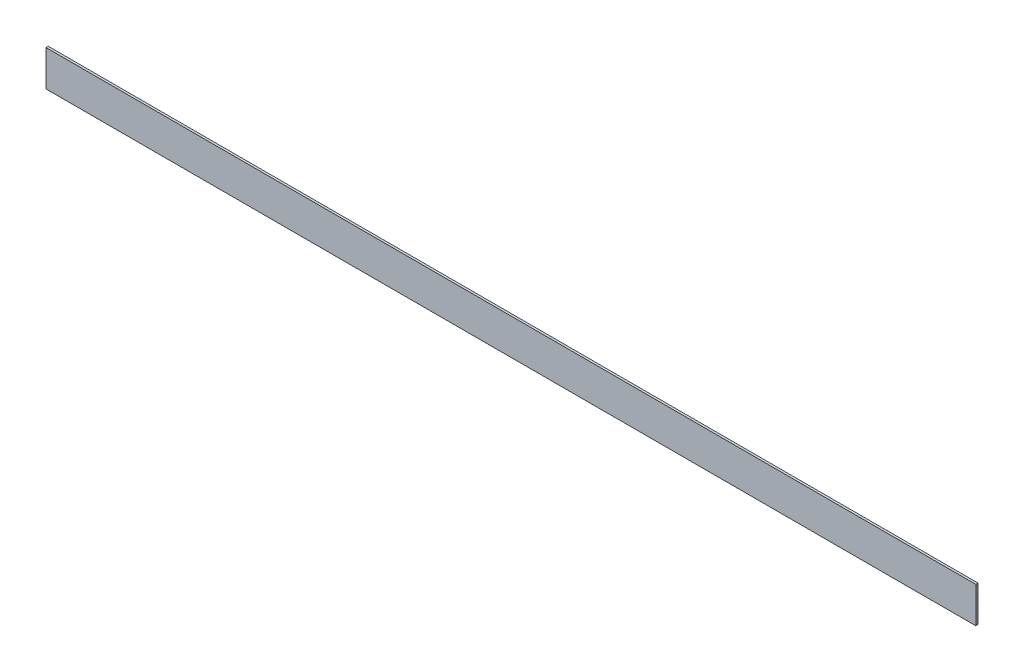
ISO-10303-21;
HEADER;
FILE_DESCRIPTION(('STEP AP214'),'2;1');
FILE_NAME('part.step','',(''),(''),'','','');
FILE_SCHEMA(('AUTOMOTIVE_DESIGN { 1 0 10303 214 1 1 1 1 }'));
ENDSEC;
DATA;
#1=APPLICATION_CONTEXT('core data for automotive mechanical design processes');
#2=APPLICATION_PROTOCOL_DEFINITION('international standard','automotive_design',2000,#1);
#3=PRODUCT_CONTEXT('',#1,'mechanical');
#4=PRODUCT('Part','Part','',(#3));
#5=PRODUCT_RELATED_PRODUCT_CATEGORY('part','',(#4));
#6=PRODUCT_DEFINITION_FORMATION('','',#4);
#7=PRODUCT_DEFINITION_CONTEXT('part definition',#1,'design');
#8=PRODUCT_DEFINITION('design','',#6,#7);
#9=PRODUCT_DEFINITION_SHAPE('','',#8);
#10=(LENGTH_UNIT() NAMED_UNIT(*) SI_UNIT(.MILLI.,.METRE.));
#11=(NAMED_UNIT(*) PLANE_ANGLE_UNIT() SI_UNIT($,.RADIAN.));
#12=(NAMED_UNIT(*) SI_UNIT($,.STERADIAN.) SOLID_ANGLE_UNIT());
#13=UNCERTAINTY_MEASURE_WITH_UNIT(LENGTH_MEASURE(1.E-05),#10,'distance_accuracy_value','');
#14=(GEOMETRIC_REPRESENTATION_CONTEXT(3) GLOBAL_UNCERTAINTY_ASSIGNED_CONTEXT((#13)) GLOBAL_UNIT_ASSIGNED_CONTEXT((#10,
#11,#12)) REPRESENTATION_CONTEXT('',''));
#15=CARTESIAN_POINT('',(0.,0.,0.));
#16=DIRECTION('',(0.,0.,1.));
#17=DIRECTION('',(1.,0.,0.));
#18=AXIS2_PLACEMENT_3D('',#15,#16,#17);
#19=CARTESIAN_POINT('',(-48.1163494307194,14.2105280702125,1.27));
#20=DIRECTION('',(1.,0.,0.));
#21=DIRECTION('',(0.,0.,-1.));
#22=AXIS2_PLACEMENT_3D('',#19,#20,#21);
#23=PLANE('',#22);
#24=DIRECTION('',(0.,-1.,0.));
#25=VECTOR('',#24,1.);
#26=CARTESIAN_POINT('',(-48.1163494307194,14.2105280702125,0.));
#27=LINE('',#26,#25);
#28=CARTESIAN_POINT('',(-48.1163494307194,14.2105280702125,0.));
#29=VERTEX_POINT('',#28);
#30=CARTESIAN_POINT('',(-48.1163494307194,-6.10947192978754,0.));
#31=VERTEX_POINT('',#30);
#32=EDGE_CURVE('E96',#29,#31,#27,.T.);
#33=ORIENTED_EDGE('',*,*,#32,.T.);
#34=DIRECTION('',(0.,0.,-1.));
#35=VECTOR('',#34,1.);
#36=CARTESIAN_POINT('',(-48.1163494307194,-6.10947192978754,1.27));
#37=LINE('',#36,#35);
#38=CARTESIAN_POINT('',(-48.1163494307194,-6.10947192978754,1.27));
#39=VERTEX_POINT('',#38);
#40=EDGE_CURVE('E11',#39,#31,#37,.T.);
#41=ORIENTED_EDGE('',*,*,#40,.F.);
#42=DIRECTION('',(0.,-1.,0.));
#43=VECTOR('',#42,1.);
#44=CARTESIAN_POINT('',(-48.1163494307194,14.2105280702125,1.27));
#45=LINE('',#44,#43);
#46=CARTESIAN_POINT('',(-48.1163494307194,14.2105280702125,1.27));
#47=VERTEX_POINT('',#46);
#48=EDGE_CURVE('E84',#47,#39,#45,.T.);
#49=ORIENTED_EDGE('',*,*,#48,.F.);
#50=DIRECTION('',(0.,0.,-1.));
#51=VECTOR('',#50,1.);
#52=CARTESIAN_POINT('',(-48.1163494307194,14.2105280702125,1.27));
#53=LINE('',#52,#51);
#54=EDGE_CURVE('E92',#47,#29,#53,.T.);
#55=ORIENTED_EDGE('',*,*,#54,.T.);
#56=EDGE_LOOP('',(#33,#41,#49,#55));
#57=FACE_BOUND('',#56,.T.);
#58=ADVANCED_FACE('F33',(#57),#23,.F.);
#59=CARTESIAN_POINT('',(-48.1163494307194,-6.10947192978754,1.27));
#60=DIRECTION('',(0.,1.,0.));
#61=DIRECTION('',(0.,0.,1.));
#62=AXIS2_PLACEMENT_3D('',#59,#60,#61);
#63=PLANE('',#62);
#64=DIRECTION('',(1.,0.,0.));
#65=VECTOR('',#64,1.);
#66=CARTESIAN_POINT('',(-48.1163494307194,-6.10947192978754,0.));
#67=LINE('',#66,#65);
#68=CARTESIAN_POINT('',(478.425650569281,-6.10947192978754,0.));
#69=VERTEX_POINT('',#68);
#70=EDGE_CURVE('E88',#31,#69,#67,.T.);
#71=ORIENTED_EDGE('',*,*,#70,.T.);
#72=DIRECTION('',(0.,0.,-1.));
#73=VECTOR('',#72,1.);
#74=CARTESIAN_POINT('',(478.425650569281,-6.10947192978754,1.27));
#75=LINE('',#74,#73);
#76=CARTESIAN_POINT('',(478.425650569281,-6.10947192978754,1.27));
#77=VERTEX_POINT('',#76);
#78=EDGE_CURVE('E41',#77,#69,#75,.T.);
#79=ORIENTED_EDGE('',*,*,#78,.F.);
#80=DIRECTION('',(1.,0.,0.));
#81=VECTOR('',#80,1.);
#82=CARTESIAN_POINT('',(-48.1163494307194,-6.10947192978754,1.27));
#83=LINE('',#82,#81);
#84=EDGE_CURVE('E79',#39,#77,#83,.T.);
#85=ORIENTED_EDGE('',*,*,#84,.F.);
#86=ORIENTED_EDGE('',*,*,#40,.T.);
#87=EDGE_LOOP('',(#71,#79,#85,#86));
#88=FACE_BOUND('',#87,.T.);
#89=ADVANCED_FACE('F87',(#88),#63,.F.);
#90=CARTESIAN_POINT('',(478.425650569281,14.2105280702125,1.27));
#91=DIRECTION('',(-1.,0.,0.));
#92=DIRECTION('',(0.,0.,1.));
#93=AXIS2_PLACEMENT_3D('',#90,#91,#92);
#94=PLANE('',#93);
#95=DIRECTION('',(0.,1.,0.));
#96=VECTOR('',#95,1.);
#97=CARTESIAN_POINT('',(478.425650569281,14.2105280702125,0.));
#98=LINE('',#97,#96);
#99=CARTESIAN_POINT('',(478.425650569281,14.2105280702125,0.));
#100=VERTEX_POINT('',#99);
#101=EDGE_CURVE('E66',#69,#100,#98,.T.);
#102=ORIENTED_EDGE('',*,*,#101,.T.);
#103=DIRECTION('',(0.,0.,-1.));
#104=VECTOR('',#103,1.);
#105=CARTESIAN_POINT('',(478.425650569281,14.2105280702125,1.27));
#106=LINE('',#105,#104);
#107=CARTESIAN_POINT('',(478.425650569281,14.2105280702125,1.27));
#108=VERTEX_POINT('',#107);
#109=EDGE_CURVE('E89',#108,#100,#106,.T.);
#110=ORIENTED_EDGE('',*,*,#109,.F.);
#111=DIRECTION('',(0.,1.,0.));
#112=VECTOR('',#111,1.);
#113=CARTESIAN_POINT('',(478.425650569281,14.2105280702125,1.27));
#114=LINE('',#113,#112);
#115=EDGE_CURVE('E82',#77,#108,#114,.T.);
#116=ORIENTED_EDGE('',*,*,#115,.F.);
#117=ORIENTED_EDGE('',*,*,#78,.T.);
#118=EDGE_LOOP('',(#102,#110,#116,#117));
#119=FACE_BOUND('',#118,.T.);
#120=ADVANCED_FACE('F90',(#119),#94,.F.);
#121=CARTESIAN_POINT('',(-48.1163494307194,14.2105280702125,1.27));
#122=DIRECTION('',(0.,-1.,0.));
#123=DIRECTION('',(0.,0.,-1.));
#124=AXIS2_PLACEMENT_3D('',#121,#122,#123);
#125=PLANE('',#124);
#126=DIRECTION('',(-1.,0.,0.));
#127=VECTOR('',#126,1.);
#128=CARTESIAN_POINT('',(-48.1163494307194,14.2105280702125,0.));
#129=LINE('',#128,#127);
#130=EDGE_CURVE('E72',#100,#29,#129,.T.);
#131=ORIENTED_EDGE('',*,*,#130,.T.);
#132=ORIENTED_EDGE('',*,*,#54,.F.);
#133=DIRECTION('',(-1.,0.,0.));
#134=VECTOR('',#133,1.);
#135=CARTESIAN_POINT('',(-48.1163494307194,14.2105280702125,1.27));
#136=LINE('',#135,#134);
#137=EDGE_CURVE('E49',#108,#47,#136,.T.);
#138=ORIENTED_EDGE('',*,*,#137,.F.);
#139=ORIENTED_EDGE('',*,*,#109,.T.);
#140=EDGE_LOOP('',(#131,#132,#138,#139));
#141=FACE_BOUND('',#140,.T.);
#142=ADVANCED_FACE('F103',(#141),#125,.F.);
#143=CARTESIAN_POINT('',(0.,0.,1.27));
#144=DIRECTION('',(0.,0.,1.));
#145=DIRECTION('',(1.,0.,0.));
#146=AXIS2_PLACEMENT_3D('',#143,#144,#145);
#147=PLANE('',#146);
#148=ORIENTED_EDGE('',*,*,#48,.T.);
#149=ORIENTED_EDGE('',*,*,#84,.T.);
#150=ORIENTED_EDGE('',*,*,#115,.T.);
#151=ORIENTED_EDGE('',*,*,#137,.T.);
#152=EDGE_LOOP('',(#148,#149,#150,#151));
#153=FACE_BOUND('',#152,.T.);
#154=ADVANCED_FACE('F80',(#153),#147,.T.);
#155=CARTESIAN_POINT('',(0.,0.,0.));
#156=DIRECTION('',(0.,0.,1.));
#157=DIRECTION('',(1.,0.,0.));
#158=AXIS2_PLACEMENT_3D('',#155,#156,#157);
#159=PLANE('',#158);
#160=ORIENTED_EDGE('',*,*,#32,.F.);
#161=ORIENTED_EDGE('',*,*,#130,.F.);
#162=ORIENTED_EDGE('',*,*,#101,.F.);
#163=ORIENTED_EDGE('',*,*,#70,.F.);
#164=EDGE_LOOP('',(#160,#161,#162,#163));
#165=FACE_BOUND('',#164,.T.);
#166=ADVANCED_FACE('F106',(#165),#159,.F.);
#167=CLOSED_SHELL('',(#58,#89,#120,#142,#154,#166));
#168=MANIFOLD_SOLID_BREP('B2',#167);
#169=ADVANCED_BREP_SHAPE_REPRESENTATION('',(#18,#168),#14);
#170=SHAPE_DEFINITION_REPRESENTATION(#9,#169);
ENDSEC;
END-ISO-10303-21;
